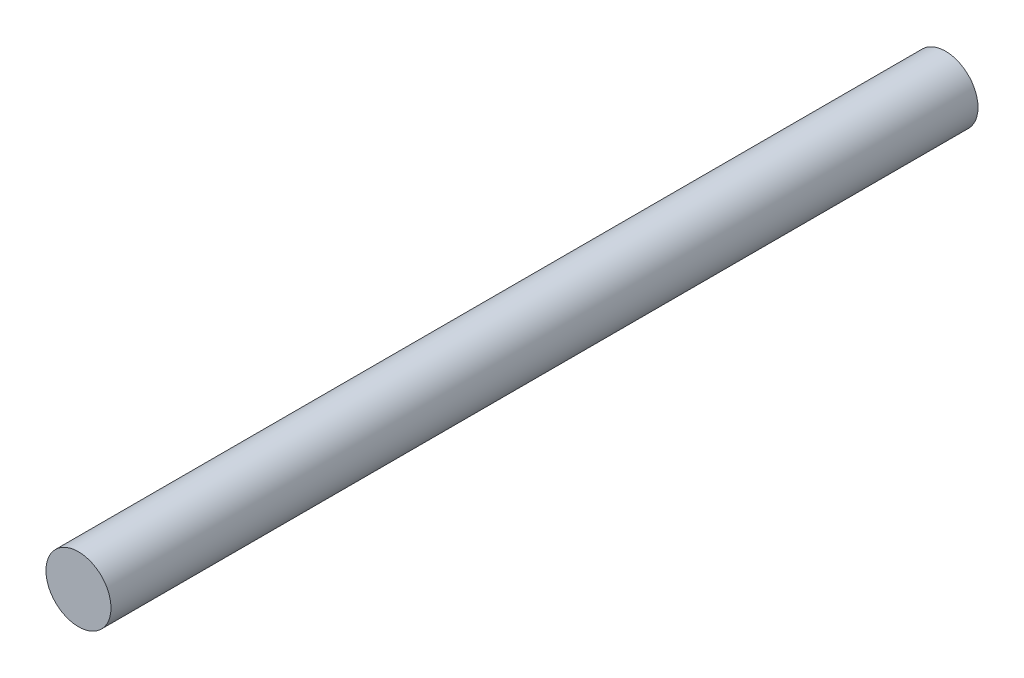
ISO-10303-21;
HEADER;
FILE_DESCRIPTION(('STEP AP214'),'2;1');
FILE_NAME('part.step','',(''),(''),'','','');
FILE_SCHEMA(('AUTOMOTIVE_DESIGN { 1 0 10303 214 1 1 1 1 }'));
ENDSEC;
DATA;
#1=APPLICATION_CONTEXT('core data for automotive mechanical design processes');
#2=APPLICATION_PROTOCOL_DEFINITION('international standard','automotive_design',2000,#1);
#3=PRODUCT_CONTEXT('',#1,'mechanical');
#4=PRODUCT('Part','Part','',(#3));
#5=PRODUCT_RELATED_PRODUCT_CATEGORY('part','',(#4));
#6=PRODUCT_DEFINITION_FORMATION('','',#4);
#7=PRODUCT_DEFINITION_CONTEXT('part definition',#1,'design');
#8=PRODUCT_DEFINITION('design','',#6,#7);
#9=PRODUCT_DEFINITION_SHAPE('','',#8);
#10=(LENGTH_UNIT() NAMED_UNIT(*) SI_UNIT(.MILLI.,.METRE.));
#11=(NAMED_UNIT(*) PLANE_ANGLE_UNIT() SI_UNIT($,.RADIAN.));
#12=(NAMED_UNIT(*) SI_UNIT($,.STERADIAN.) SOLID_ANGLE_UNIT());
#13=UNCERTAINTY_MEASURE_WITH_UNIT(LENGTH_MEASURE(1.E-05),#10,'distance_accuracy_value','');
#14=(GEOMETRIC_REPRESENTATION_CONTEXT(3) GLOBAL_UNCERTAINTY_ASSIGNED_CONTEXT((#13)) GLOBAL_UNIT_ASSIGNED_CONTEXT((#10,
#11,#12)) REPRESENTATION_CONTEXT('',''));
#15=CARTESIAN_POINT('',(0.,0.,0.));
#16=DIRECTION('',(0.,0.,1.));
#17=DIRECTION('',(1.,0.,0.));
#18=AXIS2_PLACEMENT_3D('',#15,#16,#17);
#19=CARTESIAN_POINT('',(0.,0.,80.));
#20=DIRECTION('',(0.,0.,-1.));
#21=DIRECTION('',(-1.,0.,0.));
#22=AXIS2_PLACEMENT_3D('',#19,#20,#21);
#23=CYLINDRICAL_SURFACE('',#22,3.);
#24=CARTESIAN_POINT('',(0.,0.,80.));
#25=DIRECTION('',(0.,0.,1.));
#26=DIRECTION('',(1.,0.,0.));
#27=AXIS2_PLACEMENT_3D('',#24,#25,#26);
#28=CIRCLE('',#27,3.);
#29=CARTESIAN_POINT('',(3.,0.,80.));
#30=VERTEX_POINT('',#29);
#31=EDGE_CURVE('E10',#30,#30,#28,.T.);
#32=ORIENTED_EDGE('',*,*,#31,.F.);
#33=EDGE_LOOP('',(#32));
#34=FACE_BOUND('',#33,.T.);
#35=CARTESIAN_POINT('',(0.,0.,0.));
#36=DIRECTION('',(0.,0.,1.));
#37=DIRECTION('',(1.,0.,0.));
#38=AXIS2_PLACEMENT_3D('',#35,#36,#37);
#39=CIRCLE('',#38,3.);
#40=CARTESIAN_POINT('',(3.,0.,0.));
#41=VERTEX_POINT('',#40);
#42=EDGE_CURVE('E40',#41,#41,#39,.T.);
#43=ORIENTED_EDGE('',*,*,#42,.T.);
#44=EDGE_LOOP('',(#43));
#45=FACE_BOUND('',#44,.T.);
#46=ADVANCED_FACE('F37',(#34,#45),#23,.T.);
#47=CARTESIAN_POINT('',(0.,0.,80.));
#48=DIRECTION('',(0.,0.,1.));
#49=DIRECTION('',(1.,0.,0.));
#50=AXIS2_PLACEMENT_3D('',#47,#48,#49);
#51=PLANE('',#50);
#52=ORIENTED_EDGE('',*,*,#31,.T.);
#53=EDGE_LOOP('',(#52));
#54=FACE_BOUND('',#53,.T.);
#55=ADVANCED_FACE('F54',(#54),#51,.T.);
#56=CARTESIAN_POINT('',(0.,0.,0.));
#57=DIRECTION('',(0.,0.,1.));
#58=DIRECTION('',(1.,0.,0.));
#59=AXIS2_PLACEMENT_3D('',#56,#57,#58);
#60=PLANE('',#59);
#61=ORIENTED_EDGE('',*,*,#42,.F.);
#62=EDGE_LOOP('',(#61));
#63=FACE_BOUND('',#62,.T.);
#64=ADVANCED_FACE('F52',(#63),#60,.F.);
#65=CLOSED_SHELL('',(#46,#55,#64));
#66=MANIFOLD_SOLID_BREP('B2',#65);
#67=ADVANCED_BREP_SHAPE_REPRESENTATION('',(#18,#66),#14);
#68=SHAPE_DEFINITION_REPRESENTATION(#9,#67);
ENDSEC;
END-ISO-10303-21;
